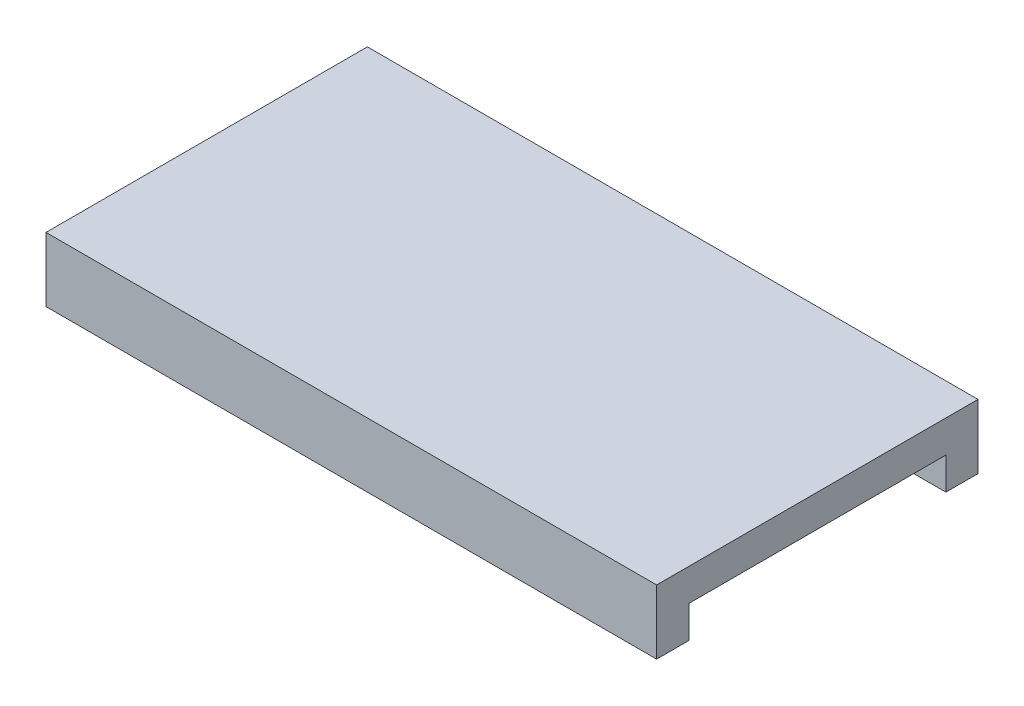
ISO-10303-21;
HEADER;
FILE_DESCRIPTION(('STEP AP214'),'2;1');
FILE_NAME('part.step','',(''),(''),'','','');
FILE_SCHEMA(('AUTOMOTIVE_DESIGN { 1 0 10303 214 1 1 1 1 }'));
ENDSEC;
DATA;
#1=APPLICATION_CONTEXT('core data for automotive mechanical design processes');
#2=APPLICATION_PROTOCOL_DEFINITION('international standard','automotive_design',2000,#1);
#3=PRODUCT_CONTEXT('',#1,'mechanical');
#4=PRODUCT('Part','Part','',(#3));
#5=PRODUCT_RELATED_PRODUCT_CATEGORY('part','',(#4));
#6=PRODUCT_DEFINITION_FORMATION('','',#4);
#7=PRODUCT_DEFINITION_CONTEXT('part definition',#1,'design');
#8=PRODUCT_DEFINITION('design','',#6,#7);
#9=PRODUCT_DEFINITION_SHAPE('','',#8);
#10=(LENGTH_UNIT() NAMED_UNIT(*) SI_UNIT(.MILLI.,.METRE.));
#11=(NAMED_UNIT(*) PLANE_ANGLE_UNIT() SI_UNIT($,.RADIAN.));
#12=(NAMED_UNIT(*) SI_UNIT($,.STERADIAN.) SOLID_ANGLE_UNIT());
#13=UNCERTAINTY_MEASURE_WITH_UNIT(LENGTH_MEASURE(1.E-05),#10,'distance_accuracy_value','');
#14=(GEOMETRIC_REPRESENTATION_CONTEXT(3) GLOBAL_UNCERTAINTY_ASSIGNED_CONTEXT((#13)) GLOBAL_UNIT_ASSIGNED_CONTEXT((#10,
#11,#12)) REPRESENTATION_CONTEXT('',''));
#15=CARTESIAN_POINT('',(0.,0.,0.));
#16=DIRECTION('',(0.,0.,1.));
#17=DIRECTION('',(1.,0.,0.));
#18=AXIS2_PLACEMENT_3D('',#15,#16,#17);
#19=CARTESIAN_POINT('',(8.974999371691,20.724999319237,-1.611602004566));
#20=DIRECTION('',(-4.37113882867398E-08,-0.999999999999995,-8.74227765734796E-08));
#21=DIRECTION('',(0.,8.74227765734797E-08,-0.999999999999996));
#22=AXIS2_PLACEMENT_3D('',#19,#20,#21);
#23=PLANE('',#22);
#24=DIRECTION('',(0.,0.,1.));
#25=VECTOR('',#24,1.);
#26=CARTESIAN_POINT('',(8.02499937169086,20.724999365134,-1.611601995824));
#27=LINE('',#26,#25);
#28=CARTESIAN_POINT('',(8.02499937169097,20.7249993547525,-1.66160200347328));
#29=VERTEX_POINT('',#28);
#30=CARTESIAN_POINT('',(8.02499937169097,20.7249993514742,-1.61160200456607));
#31=VERTEX_POINT('',#30);
#32=EDGE_CURVE('E100',#29,#31,#27,.T.);
#33=ORIENTED_EDGE('',*,*,#32,.F.);
#34=DIRECTION('',(1.,0.,0.));
#35=VECTOR('',#34,1.);
#36=CARTESIAN_POINT('',(8.974999373876,20.724999323608,-1.66160200456614));
#37=LINE('',#36,#35);
#38=CARTESIAN_POINT('',(8.97499937223721,20.7249993236081,-1.66160200347329));
#39=VERTEX_POINT('',#38);
#40=EDGE_CURVE('E99',#39,#29,#37,.F.);
#41=ORIENTED_EDGE('',*,*,#40,.F.);
#42=DIRECTION('',(0.,0.,1.));
#43=VECTOR('',#42,1.);
#44=CARTESIAN_POINT('',(8.97499937169086,20.724999323608,-1.611601995824));
#45=LINE('',#44,#43);
#46=CARTESIAN_POINT('',(8.97499937278368,20.7249993214225,-1.61160200456607));
#47=VERTEX_POINT('',#46);
#48=EDGE_CURVE('E84',#39,#47,#45,.T.);
#49=ORIENTED_EDGE('',*,*,#48,.T.);
#50=DIRECTION('',(1.,0.,0.));
#51=VECTOR('',#50,1.);
#52=CARTESIAN_POINT('',(8.974999376062,20.724999319237,-1.61160200456628));
#53=LINE('',#52,#51);
#54=EDGE_CURVE('E110',#47,#31,#53,.F.);
#55=ORIENTED_EDGE('',*,*,#54,.T.);
#56=EDGE_LOOP('',(#33,#41,#49,#55));
#57=FACE_BOUND('',#56,.T.);
#58=ADVANCED_FACE('F17',(#57),#23,.T.);
#59=CARTESIAN_POINT('',(8.974999373876,20.774999358577,-2.061602000195));
#60=DIRECTION('',(0.,8.74227765734797E-08,-0.999999999999996));
#61=DIRECTION('',(0.,0.999999999999996,8.74227765734797E-08));
#62=AXIS2_PLACEMENT_3D('',#59,#60,#61);
#63=PLANE('',#62);
#64=DIRECTION('',(-4.371138828674E-08,-0.999999999999999,0.));
#65=VECTOR('',#64,1.);
#66=CARTESIAN_POINT('',(8.974999376062,20.824999319237,-2.061602004566));
#67=LINE('',#66,#65);
#68=CARTESIAN_POINT('',(8.97499937223721,20.7249993596699,-2.06160200456604));
#69=VERTEX_POINT('',#68);
#70=CARTESIAN_POINT('',(8.97499937387611,20.77499937934,-2.06160200128775));
#71=VERTEX_POINT('',#70);
#72=EDGE_CURVE('E112',#69,#71,#67,.F.);
#73=ORIENTED_EDGE('',*,*,#72,.T.);
#74=DIRECTION('',(0.999999999999999,-4.37113882867396E-08,0.));
#75=VECTOR('',#74,1.);
#76=CARTESIAN_POINT('',(8.974999373876,20.7749993585771,-2.061602000195));
#77=LINE('',#76,#75);
#78=CARTESIAN_POINT('',(8.02499937278361,20.774999400103,-2.06160200128775));
#79=VERTEX_POINT('',#78);
#80=EDGE_CURVE('E20',#79,#71,#77,.T.);
#81=ORIENTED_EDGE('',*,*,#80,.F.);
#82=DIRECTION('',(-4.371138828674E-08,-0.999999999999999,0.));
#83=VECTOR('',#82,1.);
#84=CARTESIAN_POINT('',(8.024999376062,20.824999360763,-2.061602004566));
#85=LINE('',#84,#83);
#86=CARTESIAN_POINT('',(8.02499937169097,20.7249993908143,-2.06160200456603));
#87=VERTEX_POINT('',#86);
#88=EDGE_CURVE('E226',#87,#79,#85,.F.);
#89=ORIENTED_EDGE('',*,*,#88,.F.);
#90=DIRECTION('',(0.999999999999999,-4.37113882867396E-08,0.));
#91=VECTOR('',#90,1.);
#92=CARTESIAN_POINT('',(8.974999371691,20.7249993585773,-2.061602004566));
#93=LINE('',#92,#91);
#94=EDGE_CURVE('E78',#69,#87,#93,.F.);
#95=ORIENTED_EDGE('',*,*,#94,.F.);
#96=EDGE_LOOP('',(#73,#81,#89,#95));
#97=FACE_BOUND('',#96,.T.);
#98=ADVANCED_FACE('F124',(#97),#63,.F.);
#99=CARTESIAN_POINT('',(8.974999373876,20.774999323608,-1.661602000195));
#100=DIRECTION('',(-4.37113882867398E-08,-0.999999999999995,-8.74227765734796E-08));
#101=DIRECTION('',(0.,8.74227765734797E-08,-0.999999999999996));
#102=AXIS2_PLACEMENT_3D('',#99,#100,#101);
#103=PLANE('',#102);
#104=DIRECTION('',(0.,0.,1.));
#105=VECTOR('',#104,1.);
#106=CARTESIAN_POINT('',(8.02499937387643,20.774999400103,-1.611601995824));
#107=LINE('',#106,#105);
#108=CARTESIAN_POINT('',(8.02499937332986,20.7749993738762,-1.661602000195));
#109=VERTEX_POINT('',#108);
#110=EDGE_CURVE('E123',#79,#109,#107,.T.);
#111=ORIENTED_EDGE('',*,*,#110,.F.);
#112=ORIENTED_EDGE('',*,*,#80,.T.);
#113=DIRECTION('',(0.,0.,1.));
#114=VECTOR('',#113,1.);
#115=CARTESIAN_POINT('',(8.97499937387643,20.774999358577,-1.611601995824));
#116=LINE('',#115,#114);
#117=CARTESIAN_POINT('',(8.97499937387611,20.7749993427317,-1.661602000195));
#118=VERTEX_POINT('',#117);
#119=EDGE_CURVE('E108',#71,#118,#116,.T.);
#120=ORIENTED_EDGE('',*,*,#119,.T.);
#121=DIRECTION('',(1.,0.,0.));
#122=VECTOR('',#121,1.);
#123=CARTESIAN_POINT('',(8.974999373876,20.774999365134,-1.661602000195));
#124=LINE('',#123,#122);
#125=EDGE_CURVE('E104',#109,#118,#124,.T.);
#126=ORIENTED_EDGE('',*,*,#125,.F.);
#127=EDGE_LOOP('',(#111,#112,#120,#126));
#128=FACE_BOUND('',#127,.T.);
#129=ADVANCED_FACE('F122',(#128),#103,.T.);
#130=CARTESIAN_POINT('',(8.974999373876,20.774999323608,-1.661602000195));
#131=DIRECTION('',(0.,8.74227765734797E-08,-0.999999999999996));
#132=DIRECTION('',(0.,0.999999999999996,8.74227765734797E-08));
#133=AXIS2_PLACEMENT_3D('',#130,#131,#132);
#134=PLANE('',#133);
#135=DIRECTION('',(-4.371138828674E-08,-0.999999999999999,0.));
#136=VECTOR('',#135,1.);
#137=CARTESIAN_POINT('',(8.974999376062,20.824999319237,-1.661602000195));
#138=LINE('',#137,#136);
#139=EDGE_CURVE('E89',#118,#39,#138,.T.);
#140=ORIENTED_EDGE('',*,*,#139,.T.);
#141=ORIENTED_EDGE('',*,*,#40,.T.);
#142=DIRECTION('',(-4.371138828674E-08,-0.999999999999999,0.));
#143=VECTOR('',#142,1.);
#144=CARTESIAN_POINT('',(8.024999376062,20.824999360763,-1.661602000195));
#145=LINE('',#144,#143);
#146=EDGE_CURVE('E240',#109,#29,#145,.T.);
#147=ORIENTED_EDGE('',*,*,#146,.F.);
#148=ORIENTED_EDGE('',*,*,#125,.T.);
#149=EDGE_LOOP('',(#140,#141,#147,#148));
#150=FACE_BOUND('',#149,.T.);
#151=ADVANCED_FACE('F106',(#150),#134,.T.);
#152=CARTESIAN_POINT('',(8.974999371691,20.724999319237,-1.611602004566));
#153=DIRECTION('',(-4.37113882867398E-08,-0.999999999999995,-8.74227765734796E-08));
#154=DIRECTION('',(0.,8.74227765734797E-08,-0.999999999999996));
#155=AXIS2_PLACEMENT_3D('',#152,#153,#154);
#156=PLANE('',#155);
#157=DIRECTION('',(0.,0.,1.));
#158=VECTOR('',#157,1.);
#159=CARTESIAN_POINT('',(8.02499937169086,20.724999404474,-1.611601995824));
#160=LINE('',#159,#158);
#161=CARTESIAN_POINT('',(8.02499937169097,20.7249993940926,-2.11160200238057));
#162=VERTEX_POINT('',#161);
#163=EDGE_CURVE('E224',#162,#87,#160,.T.);
#164=ORIENTED_EDGE('',*,*,#163,.F.);
#165=DIRECTION('',(1.,0.,0.));
#166=VECTOR('',#165,1.);
#167=CARTESIAN_POINT('',(8.974999376062,20.724999362948,-2.11160200456628));
#168=LINE('',#167,#166);
#169=CARTESIAN_POINT('',(8.97499937278368,20.7249993629481,-2.11160200019507));
#170=VERTEX_POINT('',#169);
#171=EDGE_CURVE('E225',#170,#162,#168,.F.);
#172=ORIENTED_EDGE('',*,*,#171,.F.);
#173=DIRECTION('',(0.,0.,1.));
#174=VECTOR('',#173,1.);
#175=CARTESIAN_POINT('',(8.97499937169086,20.724999362948,-1.611601995824));
#176=LINE('',#175,#174);
#177=EDGE_CURVE('E96',#170,#69,#176,.T.);
#178=ORIENTED_EDGE('',*,*,#177,.T.);
#179=ORIENTED_EDGE('',*,*,#94,.T.);
#180=EDGE_LOOP('',(#164,#172,#178,#179));
#181=FACE_BOUND('',#180,.T.);
#182=ADVANCED_FACE('F153',(#181),#156,.T.);
#183=CARTESIAN_POINT('',(8.974999376062,20.824999319237,-1.611601995824));
#184=DIRECTION('',(-0.999999999999999,4.371138828674E-08,0.));
#185=DIRECTION('',(-4.371138828674E-08,-0.999999999999999,0.));
#186=AXIS2_PLACEMENT_3D('',#183,#184,#185);
#187=PLANE('',#186);
#188=ORIENTED_EDGE('',*,*,#119,.F.);
#189=ORIENTED_EDGE('',*,*,#72,.F.);
#190=ORIENTED_EDGE('',*,*,#177,.F.);
#191=DIRECTION('',(0.,0.999999999999996,8.74227765734797E-08));
#192=VECTOR('',#191,1.);
#193=CARTESIAN_POINT('',(8.974999376062,20.824999362948,-2.111601995824));
#194=LINE('',#193,#192);
#195=CARTESIAN_POINT('',(8.974999376062,20.8249993514741,-2.111601995824));
#196=VERTEX_POINT('',#195);
#197=EDGE_CURVE('E234',#196,#170,#194,.F.);
#198=ORIENTED_EDGE('',*,*,#197,.F.);
#199=DIRECTION('',(0.,8.74227765734797E-08,-0.999999999999996));
#200=VECTOR('',#199,1.);
#201=CARTESIAN_POINT('',(8.974999376062,20.824999319237,-1.611601995824));
#202=LINE('',#201,#200);
#203=CARTESIAN_POINT('',(8.974999376062,20.8249993296185,-1.611602000195));
#204=VERTEX_POINT('',#203);
#205=EDGE_CURVE('E230',#196,#204,#202,.F.);
#206=ORIENTED_EDGE('',*,*,#205,.T.);
#207=DIRECTION('',(0.,0.999999999999996,8.74227765734797E-08));
#208=VECTOR('',#207,1.);
#209=CARTESIAN_POINT('',(8.974999376062,20.824999319237,-1.611601995824));
#210=LINE('',#209,#208);
#211=EDGE_CURVE('E92',#204,#47,#210,.F.);
#212=ORIENTED_EDGE('',*,*,#211,.T.);
#213=ORIENTED_EDGE('',*,*,#48,.F.);
#214=ORIENTED_EDGE('',*,*,#139,.F.);
#215=EDGE_LOOP('',(#188,#189,#190,#198,#206,#212,#213,#214));
#216=FACE_BOUND('',#215,.T.);
#217=ADVANCED_FACE('F87',(#216),#187,.F.);
#218=CARTESIAN_POINT('',(8.974999376062,20.824999319237,-1.611601995824));
#219=DIRECTION('',(0.,8.74227765734797E-08,-0.999999999999996));
#220=DIRECTION('',(0.,0.999999999999996,8.74227765734797E-08));
#221=AXIS2_PLACEMENT_3D('',#218,#219,#220);
#222=PLANE('',#221);
#223=ORIENTED_EDGE('',*,*,#54,.F.);
#224=ORIENTED_EDGE('',*,*,#211,.F.);
#225=DIRECTION('',(0.999999999999999,-4.37113882867396E-08,0.));
#226=VECTOR('',#225,1.);
#227=CARTESIAN_POINT('',(8.974999376062,20.824999319237,-1.611601995824));
#228=LINE('',#227,#226);
#229=CARTESIAN_POINT('',(8.0249993738765,20.824999360763,-1.6116019980095));
#230=VERTEX_POINT('',#229);
#231=EDGE_CURVE('E232',#204,#230,#228,.F.);
#232=ORIENTED_EDGE('',*,*,#231,.T.);
#233=DIRECTION('',(-4.371138828674E-08,-0.999999999999999,0.));
#234=VECTOR('',#233,1.);
#235=CARTESIAN_POINT('',(8.024999376062,20.824999360763,-1.611602004566));
#236=LINE('',#235,#234);
#237=EDGE_CURVE('E227',#31,#230,#236,.F.);
#238=ORIENTED_EDGE('',*,*,#237,.F.);
#239=EDGE_LOOP('',(#223,#224,#232,#238));
#240=FACE_BOUND('',#239,.T.);
#241=ADVANCED_FACE('F146',(#240),#222,.F.);
#242=CARTESIAN_POINT('',(8.024999376062,20.824999360763,-1.611601995824));
#243=DIRECTION('',(-0.999999999999999,4.371138828674E-08,0.));
#244=DIRECTION('',(-4.371138828674E-08,-0.999999999999999,0.));
#245=AXIS2_PLACEMENT_3D('',#242,#243,#244);
#246=PLANE('',#245);
#247=ORIENTED_EDGE('',*,*,#110,.T.);
#248=ORIENTED_EDGE('',*,*,#146,.T.);
#249=ORIENTED_EDGE('',*,*,#32,.T.);
#250=ORIENTED_EDGE('',*,*,#237,.T.);
#251=DIRECTION('',(0.,8.74227765734797E-08,-0.999999999999996));
#252=VECTOR('',#251,1.);
#253=CARTESIAN_POINT('',(8.024999376062,20.8249993607628,-1.611601995824));
#254=LINE('',#253,#252);
#255=CARTESIAN_POINT('',(8.02499937496925,20.8249993826186,-2.111601995824));
#256=VERTEX_POINT('',#255);
#257=EDGE_CURVE('E26',#230,#256,#254,.T.);
#258=ORIENTED_EDGE('',*,*,#257,.T.);
#259=DIRECTION('',(0.,0.999999999999996,8.74227765734797E-08));
#260=VECTOR('',#259,1.);
#261=CARTESIAN_POINT('',(8.024999371691,20.824999362948,-2.111601995824));
#262=LINE('',#261,#260);
#263=EDGE_CURVE('E34',#162,#256,#262,.T.);
#264=ORIENTED_EDGE('',*,*,#263,.F.);
#265=ORIENTED_EDGE('',*,*,#163,.T.);
#266=ORIENTED_EDGE('',*,*,#88,.T.);
#267=EDGE_LOOP('',(#247,#248,#249,#250,#258,#264,#265,#266));
#268=FACE_BOUND('',#267,.T.);
#269=ADVANCED_FACE('F140',(#268),#246,.T.);
#270=CARTESIAN_POINT('',(8.974999376062,20.824999362948,-2.111601995824));
#271=DIRECTION('',(0.,8.74227765734797E-08,-0.999999999999996));
#272=DIRECTION('',(0.,0.999999999999996,8.74227765734797E-08));
#273=AXIS2_PLACEMENT_3D('',#270,#271,#272);
#274=PLANE('',#273);
#275=ORIENTED_EDGE('',*,*,#171,.T.);
#276=ORIENTED_EDGE('',*,*,#263,.T.);
#277=DIRECTION('',(0.999999999999999,-4.37113882867396E-08,0.));
#278=VECTOR('',#277,1.);
#279=CARTESIAN_POINT('',(8.974999376062,20.8249993629484,-2.111601995824));
#280=LINE('',#279,#278);
#281=EDGE_CURVE('E11',#256,#196,#280,.T.);
#282=ORIENTED_EDGE('',*,*,#281,.T.);
#283=ORIENTED_EDGE('',*,*,#197,.T.);
#284=EDGE_LOOP('',(#275,#276,#282,#283));
#285=FACE_BOUND('',#284,.T.);
#286=ADVANCED_FACE('F134',(#285),#274,.T.);
#287=CARTESIAN_POINT('',(8.974999376062,20.824999319237,-1.611601995824));
#288=DIRECTION('',(-4.37113882867398E-08,-0.999999999999995,-8.74227765734796E-08));
#289=DIRECTION('',(0.,8.74227765734797E-08,-0.999999999999996));
#290=AXIS2_PLACEMENT_3D('',#287,#288,#289);
#291=PLANE('',#290);
#292=ORIENTED_EDGE('',*,*,#257,.F.);
#293=ORIENTED_EDGE('',*,*,#231,.F.);
#294=ORIENTED_EDGE('',*,*,#205,.F.);
#295=ORIENTED_EDGE('',*,*,#281,.F.);
#296=EDGE_LOOP('',(#292,#293,#294,#295));
#297=FACE_BOUND('',#296,.T.);
#298=ADVANCED_FACE('F132',(#297),#291,.F.);
#299=CLOSED_SHELL('',(#58,#98,#129,#151,#182,#217,#241,#269,#286,#298));
#300=MANIFOLD_SOLID_BREP('B1',#299);
#301=ADVANCED_BREP_SHAPE_REPRESENTATION('',(#18,#300),#14);
#302=SHAPE_DEFINITION_REPRESENTATION(#9,#301);
ENDSEC;
END-ISO-10303-21;
